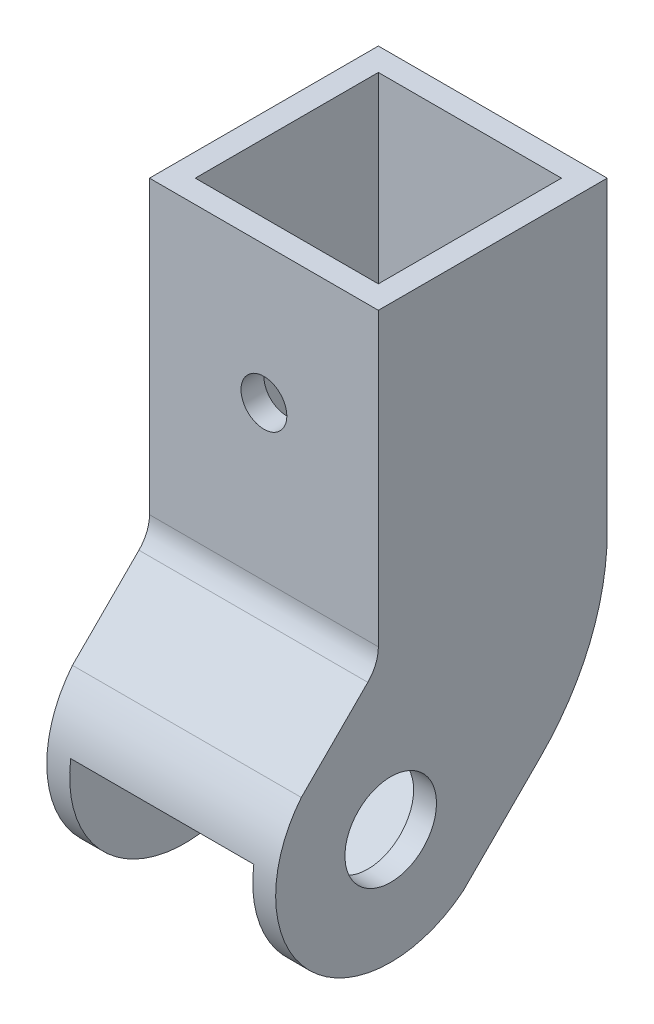
ISO-10303-21;
HEADER;
FILE_DESCRIPTION(('STEP AP214'),'2;1');
FILE_NAME('part.step','',(''),(''),'','','');
FILE_SCHEMA(('AUTOMOTIVE_DESIGN { 1 0 10303 214 1 1 1 1 }'));
ENDSEC;
DATA;
#1=APPLICATION_CONTEXT('core data for automotive mechanical design processes');
#2=APPLICATION_PROTOCOL_DEFINITION('international standard','automotive_design',2000,#1);
#3=PRODUCT_CONTEXT('',#1,'mechanical');
#4=PRODUCT('Part','Part','',(#3));
#5=PRODUCT_RELATED_PRODUCT_CATEGORY('part','',(#4));
#6=PRODUCT_DEFINITION_FORMATION('','',#4);
#7=PRODUCT_DEFINITION_CONTEXT('part definition',#1,'design');
#8=PRODUCT_DEFINITION('design','',#6,#7);
#9=PRODUCT_DEFINITION_SHAPE('','',#8);
#10=(LENGTH_UNIT() NAMED_UNIT(*) SI_UNIT(.MILLI.,.METRE.));
#11=(NAMED_UNIT(*) PLANE_ANGLE_UNIT() SI_UNIT($,.RADIAN.));
#12=(NAMED_UNIT(*) SI_UNIT($,.STERADIAN.) SOLID_ANGLE_UNIT());
#13=UNCERTAINTY_MEASURE_WITH_UNIT(LENGTH_MEASURE(1.E-05),#10,'distance_accuracy_value','');
#14=(GEOMETRIC_REPRESENTATION_CONTEXT(3) GLOBAL_UNCERTAINTY_ASSIGNED_CONTEXT((#13)) GLOBAL_UNIT_ASSIGNED_CONTEXT((#10,
#11,#12)) REPRESENTATION_CONTEXT('',''));
#15=CARTESIAN_POINT('',(0.,0.,0.));
#16=DIRECTION('',(0.,0.,1.));
#17=DIRECTION('',(1.,0.,0.));
#18=AXIS2_PLACEMENT_3D('',#15,#16,#17);
#19=CARTESIAN_POINT('',(124.79784655193,-20.2055762724056,-4.33057627240575));
#20=DIRECTION('',(0.,-0.707106781186545,-0.70710678118655));
#21=DIRECTION('',(0.,0.70710678118655,-0.707106781186545));
#22=AXIS2_PLACEMENT_3D('',#19,#20,#21);
#23=PLANE('',#22);
#24=DIRECTION('',(1.,0.,0.));
#25=VECTOR('',#24,1.);
#26=CARTESIAN_POINT('',(0.,-36.5530803468044,12.0169278019929));
#27=LINE('',#26,#25);
#28=CARTESIAN_POINT('',(28.575,-36.5530803468044,12.0169278019929));
#29=VERTEX_POINT('',#28);
#30=CARTESIAN_POINT('',(3.175,-36.5530803468044,12.0169278019929));
#31=VERTEX_POINT('',#30);
#32=EDGE_CURVE('E291',#29,#31,#27,.F.);
#33=ORIENTED_EDGE('',*,*,#32,.F.);
#34=DIRECTION('',(0.,0.70710678118655,-0.707106781186545));
#35=VECTOR('',#34,1.);
#36=CARTESIAN_POINT('',(28.575,-20.2055762724056,-4.33057627240575));
#37=LINE('',#36,#35);
#38=CARTESIAN_POINT('',(28.575,-20.2055762724056,-4.33057627240577));
#39=VERTEX_POINT('',#38);
#40=EDGE_CURVE('E245',#29,#39,#37,.T.);
#41=ORIENTED_EDGE('',*,*,#40,.T.);
#42=DIRECTION('',(-1.,0.,0.));
#43=VECTOR('',#42,1.);
#44=CARTESIAN_POINT('',(124.79784655193,-20.2055762724056,-4.33057627240577));
#45=LINE('',#44,#43);
#46=CARTESIAN_POINT('',(3.175,-20.2055762724056,-4.33057627240577));
#47=VERTEX_POINT('',#46);
#48=EDGE_CURVE('E232',#39,#47,#45,.T.);
#49=ORIENTED_EDGE('',*,*,#48,.T.);
#50=DIRECTION('',(0.,-0.70710678118655,0.707106781186545));
#51=VECTOR('',#50,1.);
#52=CARTESIAN_POINT('',(3.175,-20.2055762724056,-4.33057627240575));
#53=LINE('',#52,#51);
#54=EDGE_CURVE('E247',#47,#31,#53,.T.);
#55=ORIENTED_EDGE('',*,*,#54,.T.);
#56=EDGE_LOOP('',(#33,#41,#49,#55));
#57=FACE_BOUND('',#56,.T.);
#58=ADVANCED_FACE('F39',(#57),#23,.F.);
#59=CARTESIAN_POINT('',(124.79784655193,-22.9809703885629,34.3658423280281));
#60=DIRECTION('',(0.,0.707106781186543,0.707106781186552));
#61=DIRECTION('',(0.,-0.707106781186552,0.707106781186543));
#62=AXIS2_PLACEMENT_3D('',#59,#60,#61);
#63=PLANE('',#62);
#64=DIRECTION('',(1.,0.,0.));
#65=VECTOR('',#64,1.);
#66=CARTESIAN_POINT('',(0.,-18.592568104666,29.9774400441312));
#67=LINE('',#66,#65);
#68=CARTESIAN_POINT('',(3.175,-18.592568104666,29.9774400441312));
#69=VERTEX_POINT('',#68);
#70=CARTESIAN_POINT('',(28.575,-18.592568104666,29.9774400441312));
#71=VERTEX_POINT('',#70);
#72=EDGE_CURVE('E54',#69,#71,#67,.T.);
#73=ORIENTED_EDGE('',*,*,#72,.F.);
#74=DIRECTION('',(0.,0.707106781186552,-0.707106781186543));
#75=VECTOR('',#74,1.);
#76=CARTESIAN_POINT('',(3.175,-22.9809703885629,34.3658423280281));
#77=LINE('',#76,#75);
#78=CARTESIAN_POINT('',(3.175,-2.77959415460185,14.1644660940672));
#79=VERTEX_POINT('',#78);
#80=EDGE_CURVE('E216',#69,#79,#77,.T.);
#81=ORIENTED_EDGE('',*,*,#80,.T.);
#82=DIRECTION('',(-1.,0.,0.));
#83=VECTOR('',#82,1.);
#84=CARTESIAN_POINT('',(124.79784655193,-2.77959415460184,14.1644660940672));
#85=LINE('',#84,#83);
#86=CARTESIAN_POINT('',(28.575,-2.77959415460184,14.1644660940672));
#87=VERTEX_POINT('',#86);
#88=EDGE_CURVE('E204',#79,#87,#85,.F.);
#89=ORIENTED_EDGE('',*,*,#88,.T.);
#90=DIRECTION('',(0.,-0.707106781186552,0.707106781186543));
#91=VECTOR('',#90,1.);
#92=CARTESIAN_POINT('',(28.575,-22.9809703885629,34.3658423280281));
#93=LINE('',#92,#91);
#94=EDGE_CURVE('E226',#87,#71,#93,.T.);
#95=ORIENTED_EDGE('',*,*,#94,.T.);
#96=EDGE_LOOP('',(#73,#81,#89,#95));
#97=FACE_BOUND('',#96,.T.);
#98=ADVANCED_FACE('F225',(#97),#63,.F.);
#99=CARTESIAN_POINT('',(3.175,0.,15.8750000000005));
#100=DIRECTION('',(-1.,0.,0.));
#101=DIRECTION('',(0.,0.,1.));
#102=AXIS2_PLACEMENT_3D('',#99,#100,#101);
#103=PLANE('',#102);
#104=CARTESIAN_POINT('',(3.175,-20.7359063582957,14.1602660556225));
#105=DIRECTION('',(-1.,0.,0.));
#106=DIRECTION('',(0.,0.,1.));
#107=AXIS2_PLACEMENT_3D('',#104,#105,#106);
#108=CIRCLE('',#107,6.35);
#109=CARTESIAN_POINT('',(3.175,-20.7359063582957,20.5102660556225));
#110=VERTEX_POINT('',#109);
#111=EDGE_CURVE('E304',#110,#110,#108,.T.);
#112=ORIENTED_EDGE('',*,*,#111,.T.);
#113=EDGE_LOOP('',(#112));
#114=FACE_BOUND('',#113,.T.);
#115=CARTESIAN_POINT('',(3.175,-20.7359063582957,14.1602660556225));
#116=DIRECTION('',(-1.,0.,0.));
#117=DIRECTION('',(0.,0.,1.));
#118=AXIS2_PLACEMENT_3D('',#115,#116,#117);
#119=CIRCLE('',#118,15.9617321068933);
#120=EDGE_CURVE('E293',#31,#69,#119,.T.);
#121=ORIENTED_EDGE('',*,*,#120,.F.);
#122=ORIENTED_EDGE('',*,*,#54,.F.);
#123=CARTESIAN_POINT('',(3.175,0.,15.8750000000005));
#124=DIRECTION('',(-1.,0.,0.));
#125=DIRECTION('',(0.,0.,1.));
#126=AXIS2_PLACEMENT_3D('',#123,#124,#125);
#127=CIRCLE('',#126,28.5750000000005);
#128=CARTESIAN_POINT('',(3.175,0.,-12.7));
#129=VERTEX_POINT('',#128);
#130=EDGE_CURVE('E255',#129,#47,#127,.T.);
#131=ORIENTED_EDGE('',*,*,#130,.F.);
#132=DIRECTION('',(0.,-1.,0.));
#133=VECTOR('',#132,1.);
#134=CARTESIAN_POINT('',(3.175,39.325,-12.7));
#135=LINE('',#134,#133);
#136=CARTESIAN_POINT('',(3.175,42.5,-12.7));
#137=VERTEX_POINT('',#136);
#138=EDGE_CURVE('E252',#137,#129,#135,.T.);
#139=ORIENTED_EDGE('',*,*,#138,.F.);
#140=DIRECTION('',(0.,0.,1.));
#141=VECTOR('',#140,1.);
#142=CARTESIAN_POINT('',(3.175,42.5,-12.7));
#143=LINE('',#142,#141);
#144=CARTESIAN_POINT('',(3.175,42.5,12.7));
#145=VERTEX_POINT('',#144);
#146=EDGE_CURVE('E319',#137,#145,#143,.T.);
#147=ORIENTED_EDGE('',*,*,#146,.T.);
#148=DIRECTION('',(0.,1.,0.));
#149=VECTOR('',#148,1.);
#150=CARTESIAN_POINT('',(3.175,-1.31512806053458,12.7));
#151=LINE('',#150,#149);
#152=CARTESIAN_POINT('',(3.175,0.755939751330876,12.7));
#153=VERTEX_POINT('',#152);
#154=EDGE_CURVE('E218',#153,#145,#151,.T.);
#155=ORIENTED_EDGE('',*,*,#154,.F.);
#156=CARTESIAN_POINT('',(3.175,0.755939751330876,17.7));
#157=DIRECTION('',(-1.,0.,0.));
#158=DIRECTION('',(0.,0.,1.));
#159=AXIS2_PLACEMENT_3D('',#156,#157,#158);
#160=CIRCLE('',#159,5.);
#161=EDGE_CURVE('E47',#153,#79,#160,.T.);
#162=ORIENTED_EDGE('',*,*,#161,.T.);
#163=ORIENTED_EDGE('',*,*,#80,.F.);
#164=EDGE_LOOP('',(#121,#122,#131,#139,#147,#155,#162,#163));
#165=FACE_BOUND('',#164,.T.);
#166=ADVANCED_FACE('F215',(#114,#165),#103,.F.);
#167=CARTESIAN_POINT('',(28.575,0.,15.8750000000005));
#168=DIRECTION('',(-1.,0.,0.));
#169=DIRECTION('',(0.,0.,1.));
#170=AXIS2_PLACEMENT_3D('',#167,#168,#169);
#171=PLANE('',#170);
#172=CARTESIAN_POINT('',(28.575,-20.7359063582957,14.1602660556225));
#173=DIRECTION('',(-1.,0.,0.));
#174=DIRECTION('',(0.,0.,1.));
#175=AXIS2_PLACEMENT_3D('',#172,#173,#174);
#176=CIRCLE('',#175,6.35);
#177=CARTESIAN_POINT('',(28.575,-20.7359063582957,20.5102660556225));
#178=VERTEX_POINT('',#177);
#179=EDGE_CURVE('E301',#178,#178,#176,.T.);
#180=ORIENTED_EDGE('',*,*,#179,.F.);
#181=EDGE_LOOP('',(#180));
#182=FACE_BOUND('',#181,.T.);
#183=ORIENTED_EDGE('',*,*,#40,.F.);
#184=CARTESIAN_POINT('',(28.575,-20.7359063582957,14.1602660556225));
#185=DIRECTION('',(-1.,0.,0.));
#186=DIRECTION('',(0.,0.,1.));
#187=AXIS2_PLACEMENT_3D('',#184,#185,#186);
#188=CIRCLE('',#187,15.9617321068933);
#189=EDGE_CURVE('E166',#29,#71,#188,.T.);
#190=ORIENTED_EDGE('',*,*,#189,.T.);
#191=ORIENTED_EDGE('',*,*,#94,.F.);
#192=CARTESIAN_POINT('',(28.575,0.755939751330876,17.7));
#193=DIRECTION('',(-1.,0.,0.));
#194=DIRECTION('',(0.,0.,1.));
#195=AXIS2_PLACEMENT_3D('',#192,#193,#194);
#196=CIRCLE('',#195,5.);
#197=CARTESIAN_POINT('',(28.575,0.755939751330876,12.7));
#198=VERTEX_POINT('',#197);
#199=EDGE_CURVE('E12',#87,#198,#196,.F.);
#200=ORIENTED_EDGE('',*,*,#199,.T.);
#201=DIRECTION('',(0.,-1.,0.));
#202=VECTOR('',#201,1.);
#203=CARTESIAN_POINT('',(28.575,-1.31512806053458,12.7));
#204=LINE('',#203,#202);
#205=CARTESIAN_POINT('',(28.575,42.5,12.7));
#206=VERTEX_POINT('',#205);
#207=EDGE_CURVE('E231',#206,#198,#204,.T.);
#208=ORIENTED_EDGE('',*,*,#207,.F.);
#209=DIRECTION('',(0.,0.,-1.));
#210=VECTOR('',#209,1.);
#211=CARTESIAN_POINT('',(28.575,42.5,12.7));
#212=LINE('',#211,#210);
#213=CARTESIAN_POINT('',(28.575,42.5,-12.7));
#214=VERTEX_POINT('',#213);
#215=EDGE_CURVE('E323',#206,#214,#212,.T.);
#216=ORIENTED_EDGE('',*,*,#215,.T.);
#217=DIRECTION('',(0.,1.,0.));
#218=VECTOR('',#217,1.);
#219=CARTESIAN_POINT('',(28.575,39.325,-12.7));
#220=LINE('',#219,#218);
#221=CARTESIAN_POINT('',(28.575,0.,-12.7));
#222=VERTEX_POINT('',#221);
#223=EDGE_CURVE('E234',#222,#214,#220,.T.);
#224=ORIENTED_EDGE('',*,*,#223,.F.);
#225=CARTESIAN_POINT('',(28.575,0.,15.8750000000005));
#226=DIRECTION('',(-1.,0.,0.));
#227=DIRECTION('',(0.,0.,1.));
#228=AXIS2_PLACEMENT_3D('',#225,#226,#227);
#229=CIRCLE('',#228,28.5750000000005);
#230=EDGE_CURVE('E243',#39,#222,#229,.F.);
#231=ORIENTED_EDGE('',*,*,#230,.F.);
#232=EDGE_LOOP('',(#183,#190,#191,#200,#208,#216,#224,#231));
#233=FACE_BOUND('',#232,.T.);
#234=ADVANCED_FACE('F229',(#182,#233),#171,.T.);
#235=CARTESIAN_POINT('',(31.75,-22.980970388563,38.8559703885627));
#236=DIRECTION('',(0.,-0.707106781186543,-0.707106781186552));
#237=DIRECTION('',(0.,0.707106781186552,-0.707106781186543));
#238=AXIS2_PLACEMENT_3D('',#235,#236,#237);
#239=PLANE('',#238);
#240=DIRECTION('',(1.,0.,0.));
#241=VECTOR('',#240,1.);
#242=CARTESIAN_POINT('',(0.,-10.6855897925329,26.5605897925327));
#243=LINE('',#242,#241);
#244=CARTESIAN_POINT('',(0.,-10.6855897925329,26.5605897925327));
#245=VERTEX_POINT('',#244);
#246=CARTESIAN_POINT('',(31.75,-10.6855897925329,26.5605897925327));
#247=VERTEX_POINT('',#246);
#248=EDGE_CURVE('E62',#245,#247,#243,.T.);
#249=ORIENTED_EDGE('',*,*,#248,.T.);
#250=DIRECTION('',(0.,-0.707106781186552,0.707106781186543));
#251=VECTOR('',#250,1.);
#252=CARTESIAN_POINT('',(31.75,-22.980970388563,38.8559703885627));
#253=LINE('',#252,#251);
#254=CARTESIAN_POINT('',(31.75,-1.46446609406728,17.3394660940672));
#255=VERTEX_POINT('',#254);
#256=EDGE_CURVE('E261',#255,#247,#253,.T.);
#257=ORIENTED_EDGE('',*,*,#256,.F.);
#258=DIRECTION('',(-1.,0.,0.));
#259=VECTOR('',#258,1.);
#260=CARTESIAN_POINT('',(0.,-1.46446609406727,17.3394660940672));
#261=LINE('',#260,#259);
#262=CARTESIAN_POINT('',(0.,-1.46446609406728,17.3394660940672));
#263=VERTEX_POINT('',#262);
#264=EDGE_CURVE('E196',#255,#263,#261,.T.);
#265=ORIENTED_EDGE('',*,*,#264,.T.);
#266=DIRECTION('',(0.,-0.707106781186552,0.707106781186543));
#267=VECTOR('',#266,1.);
#268=CARTESIAN_POINT('',(0.,-22.980970388563,38.8559703885627));
#269=LINE('',#268,#267);
#270=EDGE_CURVE('E172',#263,#245,#269,.T.);
#271=ORIENTED_EDGE('',*,*,#270,.T.);
#272=EDGE_LOOP('',(#249,#257,#265,#271));
#273=FACE_BOUND('',#272,.T.);
#274=ADVANCED_FACE('F285',(#273),#239,.F.);
#275=CARTESIAN_POINT('',(31.75,-45.4316106912357,16.4053300858896));
#276=DIRECTION('',(0.,0.707106781186542,0.707106781186553));
#277=DIRECTION('',(0.,-0.707106781186553,0.707106781186542));
#278=AXIS2_PLACEMENT_3D('',#275,#276,#277);
#279=PLANE('',#278);
#280=DIRECTION('',(1.,0.,0.));
#281=VECTOR('',#280,1.);
#282=CARTESIAN_POINT('',(0.,-33.1362300952077,4.10994948986176));
#283=LINE('',#282,#281);
#284=CARTESIAN_POINT('',(0.,-33.1362300952077,4.10994948986176));
#285=VERTEX_POINT('',#284);
#286=CARTESIAN_POINT('',(31.75,-33.1362300952077,4.10994948986176));
#287=VERTEX_POINT('',#286);
#288=EDGE_CURVE('E151',#285,#287,#283,.T.);
#289=ORIENTED_EDGE('',*,*,#288,.F.);
#290=DIRECTION('',(0.,0.707106781186553,-0.707106781186542));
#291=VECTOR('',#290,1.);
#292=CARTESIAN_POINT('',(0.,-45.4316106912357,16.4053300858896));
#293=LINE('',#292,#291);
#294=CARTESIAN_POINT('',(0.,-22.4506403026728,-6.57564030267305));
#295=VERTEX_POINT('',#294);
#296=EDGE_CURVE('E163',#285,#295,#293,.T.);
#297=ORIENTED_EDGE('',*,*,#296,.T.);
#298=DIRECTION('',(-1.,0.,0.));
#299=VECTOR('',#298,1.);
#300=CARTESIAN_POINT('',(31.75,-22.4506403026728,-6.57564030267305));
#301=LINE('',#300,#299);
#302=CARTESIAN_POINT('',(31.75,-22.4506403026728,-6.57564030267305));
#303=VERTEX_POINT('',#302);
#304=EDGE_CURVE('E194',#303,#295,#301,.T.);
#305=ORIENTED_EDGE('',*,*,#304,.F.);
#306=DIRECTION('',(0.,0.707106781186553,-0.707106781186542));
#307=VECTOR('',#306,1.);
#308=CARTESIAN_POINT('',(31.75,-45.4316106912357,16.4053300858896));
#309=LINE('',#308,#307);
#310=EDGE_CURVE('E165',#287,#303,#309,.T.);
#311=ORIENTED_EDGE('',*,*,#310,.F.);
#312=EDGE_LOOP('',(#289,#297,#305,#311));
#313=FACE_BOUND('',#312,.T.);
#314=ADVANCED_FACE('F161',(#313),#279,.F.);
#315=CARTESIAN_POINT('',(31.75,0.,15.8750000000005));
#316=DIRECTION('',(-1.,0.,0.));
#317=DIRECTION('',(0.,0.,1.));
#318=AXIS2_PLACEMENT_3D('',#315,#316,#317);
#319=PLANE('',#318);
#320=CARTESIAN_POINT('',(31.75,-20.7359063582957,14.1602660556225));
#321=DIRECTION('',(1.,0.,0.));
#322=DIRECTION('',(0.,0.,-1.));
#323=AXIS2_PLACEMENT_3D('',#320,#321,#322);
#324=CIRCLE('',#323,6.35);
#325=CARTESIAN_POINT('',(31.75,-20.7359063582957,7.8102660556225));
#326=VERTEX_POINT('',#325);
#327=EDGE_CURVE('E295',#326,#326,#324,.T.);
#328=ORIENTED_EDGE('',*,*,#327,.F.);
#329=EDGE_LOOP('',(#328));
#330=FACE_BOUND('',#329,.T.);
#331=CARTESIAN_POINT('',(31.75,-20.7359063582957,14.1602660556225));
#332=DIRECTION('',(1.,0.,0.));
#333=DIRECTION('',(0.,0.,-1.));
#334=AXIS2_PLACEMENT_3D('',#331,#332,#333);
#335=CIRCLE('',#334,15.9617321068933);
#336=EDGE_CURVE('E157',#247,#287,#335,.T.);
#337=ORIENTED_EDGE('',*,*,#336,.T.);
#338=ORIENTED_EDGE('',*,*,#310,.T.);
#339=CARTESIAN_POINT('',(31.75,0.,15.8750000000005));
#340=DIRECTION('',(1.,0.,0.));
#341=DIRECTION('',(0.,0.,1.));
#342=AXIS2_PLACEMENT_3D('',#339,#340,#341);
#343=CIRCLE('',#342,31.7500000000004);
#344=CARTESIAN_POINT('',(31.75,0.,-15.875));
#345=VERTEX_POINT('',#344);
#346=EDGE_CURVE('E265',#303,#345,#343,.T.);
#347=ORIENTED_EDGE('',*,*,#346,.T.);
#348=DIRECTION('',(0.,1.,0.));
#349=VECTOR('',#348,1.);
#350=CARTESIAN_POINT('',(31.75,42.5,-15.875));
#351=LINE('',#350,#349);
#352=CARTESIAN_POINT('',(31.75,42.5,-15.875));
#353=VERTEX_POINT('',#352);
#354=EDGE_CURVE('E267',#345,#353,#351,.T.);
#355=ORIENTED_EDGE('',*,*,#354,.T.);
#356=DIRECTION('',(0.,0.,1.));
#357=VECTOR('',#356,1.);
#358=CARTESIAN_POINT('',(31.75,42.5,-15.875));
#359=LINE('',#358,#357);
#360=CARTESIAN_POINT('',(31.75,42.5,15.875));
#361=VERTEX_POINT('',#360);
#362=EDGE_CURVE('E188',#353,#361,#359,.T.);
#363=ORIENTED_EDGE('',*,*,#362,.T.);
#364=DIRECTION('',(0.,-1.,0.));
#365=VECTOR('',#364,1.);
#366=CARTESIAN_POINT('',(31.75,42.5,15.875));
#367=LINE('',#366,#365);
#368=CARTESIAN_POINT('',(31.75,2.07106781186544,15.875));
#369=VERTEX_POINT('',#368);
#370=EDGE_CURVE('E183',#361,#369,#367,.T.);
#371=ORIENTED_EDGE('',*,*,#370,.T.);
#372=CARTESIAN_POINT('',(31.75,2.07106781186544,20.875));
#373=DIRECTION('',(-1.,0.,0.));
#374=DIRECTION('',(0.,0.,1.));
#375=AXIS2_PLACEMENT_3D('',#372,#373,#374);
#376=CIRCLE('',#375,5.);
#377=EDGE_CURVE('E208',#369,#255,#376,.T.);
#378=ORIENTED_EDGE('',*,*,#377,.T.);
#379=ORIENTED_EDGE('',*,*,#256,.T.);
#380=EDGE_LOOP('',(#337,#338,#347,#355,#363,#371,#378,#379));
#381=FACE_BOUND('',#380,.T.);
#382=ADVANCED_FACE('F283',(#330,#381),#319,.F.);
#383=CARTESIAN_POINT('',(0.,0.,15.8750000000005));
#384=DIRECTION('',(-1.,0.,0.));
#385=DIRECTION('',(0.,0.,1.));
#386=AXIS2_PLACEMENT_3D('',#383,#384,#385);
#387=PLANE('',#386);
#388=CARTESIAN_POINT('',(0.,-20.7359063582957,14.1602660556225));
#389=DIRECTION('',(-1.,0.,0.));
#390=DIRECTION('',(0.,0.,1.));
#391=AXIS2_PLACEMENT_3D('',#388,#389,#390);
#392=CIRCLE('',#391,6.35);
#393=CARTESIAN_POINT('',(0.,-20.7359063582957,20.5102660556225));
#394=VERTEX_POINT('',#393);
#395=EDGE_CURVE('E298',#394,#394,#392,.F.);
#396=ORIENTED_EDGE('',*,*,#395,.T.);
#397=EDGE_LOOP('',(#396));
#398=FACE_BOUND('',#397,.T.);
#399=ORIENTED_EDGE('',*,*,#296,.F.);
#400=CARTESIAN_POINT('',(0.,-20.7359063582957,14.1602660556225));
#401=DIRECTION('',(1.,0.,0.));
#402=DIRECTION('',(0.,0.,-1.));
#403=AXIS2_PLACEMENT_3D('',#400,#401,#402);
#404=CIRCLE('',#403,15.9617321068933);
#405=EDGE_CURVE('E148',#245,#285,#404,.T.);
#406=ORIENTED_EDGE('',*,*,#405,.F.);
#407=ORIENTED_EDGE('',*,*,#270,.F.);
#408=CARTESIAN_POINT('',(0.,2.07106781186544,20.875));
#409=DIRECTION('',(-1.,0.,0.));
#410=DIRECTION('',(0.,0.,1.));
#411=AXIS2_PLACEMENT_3D('',#408,#409,#410);
#412=CIRCLE('',#411,5.);
#413=CARTESIAN_POINT('',(0.,2.07106781186544,15.875));
#414=VERTEX_POINT('',#413);
#415=EDGE_CURVE('E206',#263,#414,#412,.F.);
#416=ORIENTED_EDGE('',*,*,#415,.T.);
#417=DIRECTION('',(0.,-1.,0.));
#418=VECTOR('',#417,1.);
#419=CARTESIAN_POINT('',(0.,42.5,15.875));
#420=LINE('',#419,#418);
#421=CARTESIAN_POINT('',(0.,42.5,15.875));
#422=VERTEX_POINT('',#421);
#423=EDGE_CURVE('E176',#422,#414,#420,.T.);
#424=ORIENTED_EDGE('',*,*,#423,.F.);
#425=DIRECTION('',(0.,0.,1.));
#426=VECTOR('',#425,1.);
#427=CARTESIAN_POINT('',(0.,42.5,-15.875));
#428=LINE('',#427,#426);
#429=CARTESIAN_POINT('',(0.,42.5,-15.875));
#430=VERTEX_POINT('',#429);
#431=EDGE_CURVE('E181',#430,#422,#428,.T.);
#432=ORIENTED_EDGE('',*,*,#431,.F.);
#433=DIRECTION('',(0.,1.,0.));
#434=VECTOR('',#433,1.);
#435=CARTESIAN_POINT('',(0.,42.5,-15.875));
#436=LINE('',#435,#434);
#437=CARTESIAN_POINT('',(0.,0.,-15.875));
#438=VERTEX_POINT('',#437);
#439=EDGE_CURVE('E174',#438,#430,#436,.T.);
#440=ORIENTED_EDGE('',*,*,#439,.F.);
#441=CARTESIAN_POINT('',(0.,0.,15.8750000000005));
#442=DIRECTION('',(1.,0.,0.));
#443=DIRECTION('',(0.,0.,1.));
#444=AXIS2_PLACEMENT_3D('',#441,#442,#443);
#445=CIRCLE('',#444,31.7500000000004);
#446=EDGE_CURVE('E171',#295,#438,#445,.T.);
#447=ORIENTED_EDGE('',*,*,#446,.F.);
#448=EDGE_LOOP('',(#399,#406,#407,#416,#424,#432,#440,#447));
#449=FACE_BOUND('',#448,.T.);
#450=ADVANCED_FACE('F169',(#398,#449),#387,.T.);
#451=CARTESIAN_POINT('',(124.79784655193,0.,15.8750000000005));
#452=DIRECTION('',(-1.,0.,0.));
#453=DIRECTION('',(0.,0.,1.));
#454=AXIS2_PLACEMENT_3D('',#451,#452,#453);
#455=CYLINDRICAL_SURFACE('',#454,28.5750000000005);
#456=ORIENTED_EDGE('',*,*,#230,.T.);
#457=DIRECTION('',(-1.,0.,0.));
#458=VECTOR('',#457,1.);
#459=CARTESIAN_POINT('',(124.79784655193,0.,-12.7));
#460=LINE('',#459,#458);
#461=EDGE_CURVE('E236',#222,#129,#460,.T.);
#462=ORIENTED_EDGE('',*,*,#461,.T.);
#463=ORIENTED_EDGE('',*,*,#130,.T.);
#464=ORIENTED_EDGE('',*,*,#48,.F.);
#465=EDGE_LOOP('',(#456,#462,#463,#464));
#466=FACE_BOUND('',#465,.T.);
#467=ADVANCED_FACE('F341',(#466),#455,.F.);
#468=CARTESIAN_POINT('',(124.79784655193,39.325,-12.7));
#469=DIRECTION('',(0.,0.,-1.));
#470=DIRECTION('',(-1.,0.,0.));
#471=AXIS2_PLACEMENT_3D('',#468,#469,#470);
#472=PLANE('',#471);
#473=CARTESIAN_POINT('',(15.875,23.45,-12.7));
#474=DIRECTION('',(0.,0.,-1.));
#475=DIRECTION('',(-1.,0.,0.));
#476=AXIS2_PLACEMENT_3D('',#473,#474,#475);
#477=CIRCLE('',#476,3.175);
#478=CARTESIAN_POINT('',(12.7,23.45,-12.7));
#479=VERTEX_POINT('',#478);
#480=EDGE_CURVE('E316',#479,#479,#477,.T.);
#481=ORIENTED_EDGE('',*,*,#480,.T.);
#482=EDGE_LOOP('',(#481));
#483=FACE_BOUND('',#482,.T.);
#484=ORIENTED_EDGE('',*,*,#223,.T.);
#485=DIRECTION('',(-1.,0.,0.));
#486=VECTOR('',#485,1.);
#487=CARTESIAN_POINT('',(28.575,42.5,-12.7));
#488=LINE('',#487,#486);
#489=EDGE_CURVE('E239',#214,#137,#488,.T.);
#490=ORIENTED_EDGE('',*,*,#489,.T.);
#491=ORIENTED_EDGE('',*,*,#138,.T.);
#492=ORIENTED_EDGE('',*,*,#461,.F.);
#493=EDGE_LOOP('',(#484,#490,#491,#492));
#494=FACE_BOUND('',#493,.T.);
#495=ADVANCED_FACE('F331',(#483,#494),#472,.F.);
#496=CARTESIAN_POINT('',(124.79784655193,-1.31512806053458,12.7));
#497=DIRECTION('',(0.,0.,1.));
#498=DIRECTION('',(1.,0.,0.));
#499=AXIS2_PLACEMENT_3D('',#496,#497,#498);
#500=PLANE('',#499);
#501=CARTESIAN_POINT('',(15.875,23.45,12.7));
#502=DIRECTION('',(0.,0.,1.));
#503=DIRECTION('',(1.,0.,0.));
#504=AXIS2_PLACEMENT_3D('',#501,#502,#503);
#505=CIRCLE('',#504,3.175);
#506=CARTESIAN_POINT('',(19.05,23.45,12.7));
#507=VERTEX_POINT('',#506);
#508=EDGE_CURVE('E313',#507,#507,#505,.T.);
#509=ORIENTED_EDGE('',*,*,#508,.T.);
#510=EDGE_LOOP('',(#509));
#511=FACE_BOUND('',#510,.T.);
#512=ORIENTED_EDGE('',*,*,#207,.T.);
#513=DIRECTION('',(-1.,0.,0.));
#514=VECTOR('',#513,1.);
#515=CARTESIAN_POINT('',(124.79784655193,0.755939751330876,12.7));
#516=LINE('',#515,#514);
#517=EDGE_CURVE('E201',#198,#153,#516,.T.);
#518=ORIENTED_EDGE('',*,*,#517,.T.);
#519=ORIENTED_EDGE('',*,*,#154,.T.);
#520=DIRECTION('',(1.,0.,0.));
#521=VECTOR('',#520,1.);
#522=CARTESIAN_POINT('',(3.175,42.5,12.7));
#523=LINE('',#522,#521);
#524=EDGE_CURVE('E321',#145,#206,#523,.T.);
#525=ORIENTED_EDGE('',*,*,#524,.T.);
#526=EDGE_LOOP('',(#512,#518,#519,#525));
#527=FACE_BOUND('',#526,.T.);
#528=ADVANCED_FACE('F383',(#511,#527),#500,.F.);
#529=CARTESIAN_POINT('',(31.75,42.5,15.875));
#530=DIRECTION('',(0.,0.,-1.));
#531=DIRECTION('',(-1.,0.,0.));
#532=AXIS2_PLACEMENT_3D('',#529,#530,#531);
#533=PLANE('',#532);
#534=CARTESIAN_POINT('',(15.875,23.45,15.875));
#535=DIRECTION('',(0.,0.,-1.));
#536=DIRECTION('',(-1.,0.,0.));
#537=AXIS2_PLACEMENT_3D('',#534,#535,#536);
#538=CIRCLE('',#537,3.175);
#539=CARTESIAN_POINT('',(12.7,23.45,15.875));
#540=VERTEX_POINT('',#539);
#541=EDGE_CURVE('E310',#540,#540,#538,.F.);
#542=ORIENTED_EDGE('',*,*,#541,.F.);
#543=EDGE_LOOP('',(#542));
#544=FACE_BOUND('',#543,.T.);
#545=ORIENTED_EDGE('',*,*,#423,.T.);
#546=DIRECTION('',(-1.,0.,0.));
#547=VECTOR('',#546,1.);
#548=CARTESIAN_POINT('',(31.75,2.07106781186544,15.875));
#549=LINE('',#548,#547);
#550=EDGE_CURVE('E199',#414,#369,#549,.F.);
#551=ORIENTED_EDGE('',*,*,#550,.T.);
#552=ORIENTED_EDGE('',*,*,#370,.F.);
#553=DIRECTION('',(-1.,0.,0.));
#554=VECTOR('',#553,1.);
#555=CARTESIAN_POINT('',(31.75,42.5,15.875));
#556=LINE('',#555,#554);
#557=EDGE_CURVE('E184',#361,#422,#556,.T.);
#558=ORIENTED_EDGE('',*,*,#557,.T.);
#559=EDGE_LOOP('',(#545,#551,#552,#558));
#560=FACE_BOUND('',#559,.T.);
#561=ADVANCED_FACE('F273',(#544,#560),#533,.F.);
#562=CARTESIAN_POINT('',(31.75,0.,15.8750000000005));
#563=DIRECTION('',(-1.,0.,0.));
#564=DIRECTION('',(0.,0.,1.));
#565=AXIS2_PLACEMENT_3D('',#562,#563,#564);
#566=CYLINDRICAL_SURFACE('',#565,31.7500000000004);
#567=ORIENTED_EDGE('',*,*,#446,.T.);
#568=DIRECTION('',(-1.,0.,0.));
#569=VECTOR('',#568,1.);
#570=CARTESIAN_POINT('',(31.75,0.,-15.875));
#571=LINE('',#570,#569);
#572=EDGE_CURVE('E191',#345,#438,#571,.T.);
#573=ORIENTED_EDGE('',*,*,#572,.F.);
#574=ORIENTED_EDGE('',*,*,#346,.F.);
#575=ORIENTED_EDGE('',*,*,#304,.T.);
#576=EDGE_LOOP('',(#567,#573,#574,#575));
#577=FACE_BOUND('',#576,.T.);
#578=ADVANCED_FACE('F373',(#577),#566,.T.);
#579=CARTESIAN_POINT('',(31.75,42.5,-15.875));
#580=DIRECTION('',(0.,0.,1.));
#581=DIRECTION('',(1.,0.,0.));
#582=AXIS2_PLACEMENT_3D('',#579,#580,#581);
#583=PLANE('',#582);
#584=CARTESIAN_POINT('',(15.875,23.45,-15.875));
#585=DIRECTION('',(0.,0.,-1.));
#586=DIRECTION('',(-1.,0.,0.));
#587=AXIS2_PLACEMENT_3D('',#584,#585,#586);
#588=CIRCLE('',#587,3.175);
#589=CARTESIAN_POINT('',(12.7,23.45,-15.875));
#590=VERTEX_POINT('',#589);
#591=EDGE_CURVE('E307',#590,#590,#588,.T.);
#592=ORIENTED_EDGE('',*,*,#591,.F.);
#593=EDGE_LOOP('',(#592));
#594=FACE_BOUND('',#593,.T.);
#595=ORIENTED_EDGE('',*,*,#439,.T.);
#596=DIRECTION('',(-1.,0.,0.));
#597=VECTOR('',#596,1.);
#598=CARTESIAN_POINT('',(31.75,42.5,-15.875));
#599=LINE('',#598,#597);
#600=EDGE_CURVE('E187',#353,#430,#599,.T.);
#601=ORIENTED_EDGE('',*,*,#600,.F.);
#602=ORIENTED_EDGE('',*,*,#354,.F.);
#603=ORIENTED_EDGE('',*,*,#572,.T.);
#604=EDGE_LOOP('',(#595,#601,#602,#603));
#605=FACE_BOUND('',#604,.T.);
#606=ADVANCED_FACE('F370',(#594,#605),#583,.F.);
#607=CARTESIAN_POINT('',(31.75,42.5,-15.875));
#608=DIRECTION('',(0.,-1.,0.));
#609=DIRECTION('',(0.,0.,-1.));
#610=AXIS2_PLACEMENT_3D('',#607,#608,#609);
#611=PLANE('',#610);
#612=ORIENTED_EDGE('',*,*,#524,.F.);
#613=ORIENTED_EDGE('',*,*,#146,.F.);
#614=ORIENTED_EDGE('',*,*,#489,.F.);
#615=ORIENTED_EDGE('',*,*,#215,.F.);
#616=EDGE_LOOP('',(#612,#613,#614,#615));
#617=FACE_BOUND('',#616,.T.);
#618=ORIENTED_EDGE('',*,*,#431,.T.);
#619=ORIENTED_EDGE('',*,*,#557,.F.);
#620=ORIENTED_EDGE('',*,*,#362,.F.);
#621=ORIENTED_EDGE('',*,*,#600,.T.);
#622=EDGE_LOOP('',(#618,#619,#620,#621));
#623=FACE_BOUND('',#622,.T.);
#624=ADVANCED_FACE('F336',(#617,#623),#611,.F.);
#625=CARTESIAN_POINT('',(31.75,2.07106781186544,20.875));
#626=DIRECTION('',(1.,0.,0.));
#627=DIRECTION('',(0.,0.,-1.));
#628=AXIS2_PLACEMENT_3D('',#625,#626,#627);
#629=CYLINDRICAL_SURFACE('',#628,5.);
#630=ORIENTED_EDGE('',*,*,#377,.F.);
#631=ORIENTED_EDGE('',*,*,#550,.F.);
#632=ORIENTED_EDGE('',*,*,#415,.F.);
#633=ORIENTED_EDGE('',*,*,#264,.F.);
#634=EDGE_LOOP('',(#630,#631,#632,#633));
#635=FACE_BOUND('',#634,.T.);
#636=ADVANCED_FACE('F279',(#635),#629,.F.);
#637=CARTESIAN_POINT('',(124.79784655193,0.755939751330876,17.7));
#638=DIRECTION('',(-1.,0.,0.));
#639=DIRECTION('',(0.,0.,1.));
#640=AXIS2_PLACEMENT_3D('',#637,#638,#639);
#641=CYLINDRICAL_SURFACE('',#640,5.);
#642=ORIENTED_EDGE('',*,*,#199,.F.);
#643=ORIENTED_EDGE('',*,*,#88,.F.);
#644=ORIENTED_EDGE('',*,*,#161,.F.);
#645=ORIENTED_EDGE('',*,*,#517,.F.);
#646=EDGE_LOOP('',(#642,#643,#644,#645));
#647=FACE_BOUND('',#646,.T.);
#648=ADVANCED_FACE('F41',(#647),#641,.T.);
#649=CARTESIAN_POINT('',(15.875,23.45,24.8552561210692));
#650=DIRECTION('',(0.,0.,-1.));
#651=DIRECTION('',(-1.,0.,0.));
#652=AXIS2_PLACEMENT_3D('',#649,#650,#651);
#653=CYLINDRICAL_SURFACE('',#652,3.175);
#654=ORIENTED_EDGE('',*,*,#591,.T.);
#655=EDGE_LOOP('',(#654));
#656=FACE_BOUND('',#655,.T.);
#657=ORIENTED_EDGE('',*,*,#480,.F.);
#658=EDGE_LOOP('',(#657));
#659=FACE_BOUND('',#658,.T.);
#660=ADVANCED_FACE('F389',(#656,#659),#653,.F.);
#661=ORIENTED_EDGE('',*,*,#541,.T.);
#662=EDGE_LOOP('',(#661));
#663=FACE_BOUND('',#662,.T.);
#664=ORIENTED_EDGE('',*,*,#508,.F.);
#665=EDGE_LOOP('',(#664));
#666=FACE_BOUND('',#665,.T.);
#667=ADVANCED_FACE('F393',(#663,#666),#653,.F.);
#668=CARTESIAN_POINT('',(-17.9605122421383,-20.7359063582957,14.1602660556225));
#669=DIRECTION('',(1.,0.,0.));
#670=DIRECTION('',(0.,0.,-1.));
#671=AXIS2_PLACEMENT_3D('',#668,#669,#670);
#672=CYLINDRICAL_SURFACE('',#671,6.35);
#673=ORIENTED_EDGE('',*,*,#395,.F.);
#674=EDGE_LOOP('',(#673));
#675=FACE_BOUND('',#674,.T.);
#676=ORIENTED_EDGE('',*,*,#111,.F.);
#677=EDGE_LOOP('',(#676));
#678=FACE_BOUND('',#677,.T.);
#679=ADVANCED_FACE('F351',(#675,#678),#672,.F.);
#680=ORIENTED_EDGE('',*,*,#179,.T.);
#681=EDGE_LOOP('',(#680));
#682=FACE_BOUND('',#681,.T.);
#683=ORIENTED_EDGE('',*,*,#327,.T.);
#684=EDGE_LOOP('',(#683));
#685=FACE_BOUND('',#684,.T.);
#686=ADVANCED_FACE('F346',(#682,#685),#672,.F.);
#687=CARTESIAN_POINT('',(0.,-20.7359063582957,14.1602660556225));
#688=DIRECTION('',(1.,0.,0.));
#689=DIRECTION('',(0.,0.,-1.));
#690=AXIS2_PLACEMENT_3D('',#687,#688,#689);
#691=CYLINDRICAL_SURFACE('',#690,15.9617321068933);
#692=ORIENTED_EDGE('',*,*,#336,.F.);
#693=ORIENTED_EDGE('',*,*,#248,.F.);
#694=ORIENTED_EDGE('',*,*,#405,.T.);
#695=ORIENTED_EDGE('',*,*,#288,.T.);
#696=EDGE_LOOP('',(#692,#693,#694,#695));
#697=FACE_BOUND('',#696,.T.);
#698=ORIENTED_EDGE('',*,*,#120,.T.);
#699=ORIENTED_EDGE('',*,*,#72,.T.);
#700=ORIENTED_EDGE('',*,*,#189,.F.);
#701=ORIENTED_EDGE('',*,*,#32,.T.);
#702=EDGE_LOOP('',(#698,#699,#700,#701));
#703=FACE_BOUND('',#702,.T.);
#704=ADVANCED_FACE('F150',(#697,#703),#691,.T.);
#705=CLOSED_SHELL('',(#58,#98,#166,#234,#274,#314,#382,#450,#467,#495,#528,#561,#578,#606,#624,
#636,#648,#660,#667,#679,#686,#704));
#706=MANIFOLD_SOLID_BREP('B2',#705);
#707=ADVANCED_BREP_SHAPE_REPRESENTATION('',(#18,#706),#14);
#708=SHAPE_DEFINITION_REPRESENTATION(#9,#707);
ENDSEC;
END-ISO-10303-21;
